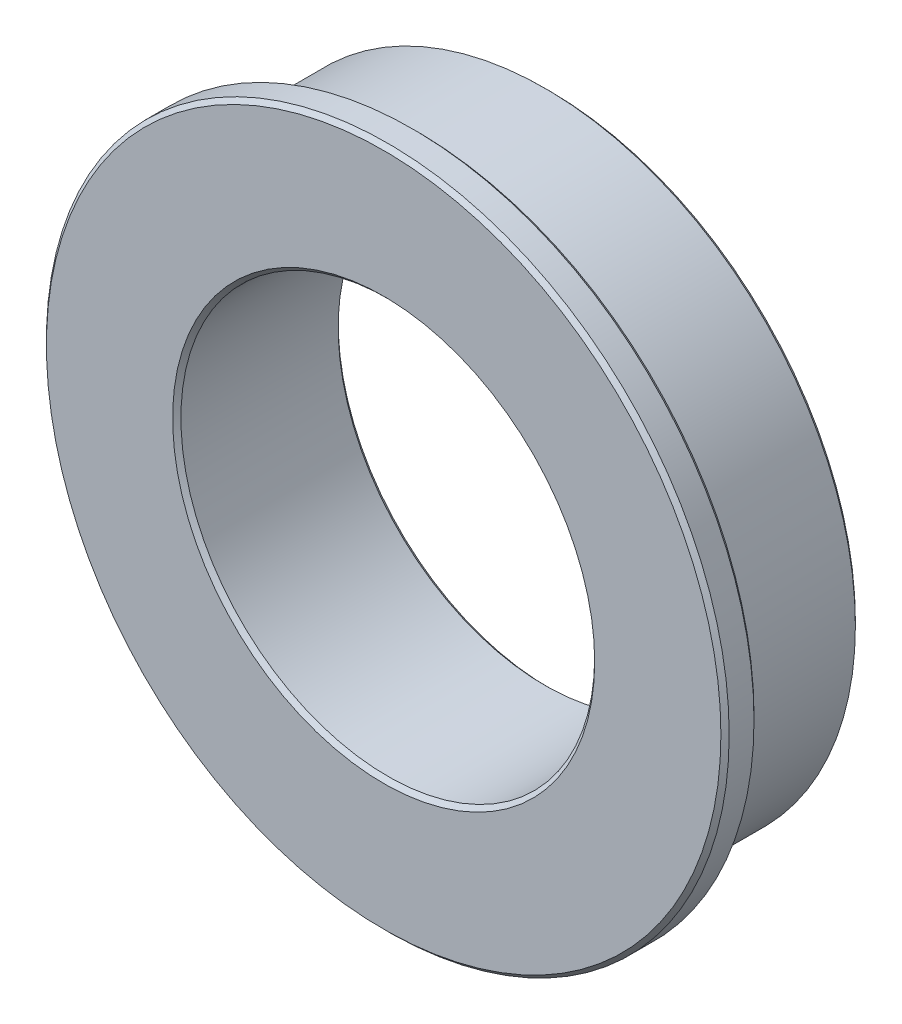
ISO-10303-21;
HEADER;
FILE_DESCRIPTION(('STEP AP214'),'2;1');
FILE_NAME('part.step','',(''),(''),'','','');
FILE_SCHEMA(('AUTOMOTIVE_DESIGN { 1 0 10303 214 1 1 1 1 }'));
ENDSEC;
DATA;
#1=APPLICATION_CONTEXT('core data for automotive mechanical design processes');
#2=APPLICATION_PROTOCOL_DEFINITION('international standard','automotive_design',2000,#1);
#3=PRODUCT_CONTEXT('',#1,'mechanical');
#4=PRODUCT('Part','Part','',(#3));
#5=PRODUCT_RELATED_PRODUCT_CATEGORY('part','',(#4));
#6=PRODUCT_DEFINITION_FORMATION('','',#4);
#7=PRODUCT_DEFINITION_CONTEXT('part definition',#1,'design');
#8=PRODUCT_DEFINITION('design','',#6,#7);
#9=PRODUCT_DEFINITION_SHAPE('','',#8);
#10=(LENGTH_UNIT() NAMED_UNIT(*) SI_UNIT(.MILLI.,.METRE.));
#11=(NAMED_UNIT(*) PLANE_ANGLE_UNIT() SI_UNIT($,.RADIAN.));
#12=(NAMED_UNIT(*) SI_UNIT($,.STERADIAN.) SOLID_ANGLE_UNIT());
#13=UNCERTAINTY_MEASURE_WITH_UNIT(LENGTH_MEASURE(1.E-05),#10,'distance_accuracy_value','');
#14=(GEOMETRIC_REPRESENTATION_CONTEXT(3) GLOBAL_UNCERTAINTY_ASSIGNED_CONTEXT((#13)) GLOBAL_UNIT_ASSIGNED_CONTEXT((#10,
#11,#12)) REPRESENTATION_CONTEXT('',''));
#15=CARTESIAN_POINT('',(0.,0.,0.));
#16=DIRECTION('',(0.,0.,1.));
#17=DIRECTION('',(1.,0.,0.));
#18=AXIS2_PLACEMENT_3D('',#15,#16,#17);
#19=CARTESIAN_POINT('',(0.,0.,4.));
#20=DIRECTION('',(0.,0.,-1.));
#21=DIRECTION('',(-1.,0.,0.));
#22=AXIS2_PLACEMENT_3D('',#19,#20,#21);
#23=CYLINDRICAL_SURFACE('',#22,7.5);
#24=CARTESIAN_POINT('',(0.,0.,0.100000000000002));
#25=DIRECTION('',(0.,0.,1.));
#26=DIRECTION('',(1.,0.,0.));
#27=AXIS2_PLACEMENT_3D('',#24,#25,#26);
#28=CIRCLE('',#27,7.5);
#29=CARTESIAN_POINT('',(7.5,0.,0.100000000000002));
#30=VERTEX_POINT('',#29);
#31=EDGE_CURVE('E57',#30,#30,#28,.T.);
#32=ORIENTED_EDGE('',*,*,#31,.T.);
#33=EDGE_LOOP('',(#32));
#34=FACE_BOUND('',#33,.T.);
#35=CARTESIAN_POINT('',(0.,0.,3.2));
#36=DIRECTION('',(0.,0.,1.));
#37=DIRECTION('',(1.,0.,0.));
#38=AXIS2_PLACEMENT_3D('',#35,#36,#37);
#39=CIRCLE('',#38,7.5);
#40=CARTESIAN_POINT('',(7.5,0.,3.2));
#41=VERTEX_POINT('',#40);
#42=EDGE_CURVE('E80',#41,#41,#39,.T.);
#43=ORIENTED_EDGE('',*,*,#42,.F.);
#44=EDGE_LOOP('',(#43));
#45=FACE_BOUND('',#44,.T.);
#46=ADVANCED_FACE('F41',(#34,#45),#23,.T.);
#47=CARTESIAN_POINT('',(0.,0.,4.));
#48=DIRECTION('',(0.,0.,1.));
#49=DIRECTION('',(1.,0.,0.));
#50=AXIS2_PLACEMENT_3D('',#47,#48,#49);
#51=PLANE('',#50);
#52=CARTESIAN_POINT('',(0.,0.,4.));
#53=DIRECTION('',(0.,0.,1.));
#54=DIRECTION('',(1.,0.,0.));
#55=AXIS2_PLACEMENT_3D('',#52,#53,#54);
#56=CIRCLE('',#55,5.1);
#57=CARTESIAN_POINT('',(5.1,0.,4.));
#58=VERTEX_POINT('',#57);
#59=EDGE_CURVE('E68',#58,#58,#56,.F.);
#60=ORIENTED_EDGE('',*,*,#59,.T.);
#61=EDGE_LOOP('',(#60));
#62=FACE_BOUND('',#61,.T.);
#63=CARTESIAN_POINT('',(0.,0.,4.));
#64=DIRECTION('',(0.,0.,1.));
#65=DIRECTION('',(1.,0.,0.));
#66=AXIS2_PLACEMENT_3D('',#63,#64,#65);
#67=CIRCLE('',#66,8.14999999999999);
#68=CARTESIAN_POINT('',(8.14999999999999,0.,4.));
#69=VERTEX_POINT('',#68);
#70=EDGE_CURVE('E71',#69,#69,#67,.T.);
#71=ORIENTED_EDGE('',*,*,#70,.T.);
#72=EDGE_LOOP('',(#71));
#73=FACE_BOUND('',#72,.T.);
#74=ADVANCED_FACE('F87',(#62,#73),#51,.T.);
#75=CARTESIAN_POINT('',(0.,0.,0.));
#76=DIRECTION('',(0.,0.,1.));
#77=DIRECTION('',(1.,0.,0.));
#78=AXIS2_PLACEMENT_3D('',#75,#76,#77);
#79=PLANE('',#78);
#80=CARTESIAN_POINT('',(0.,0.,0.));
#81=DIRECTION('',(0.,0.,1.));
#82=DIRECTION('',(1.,0.,0.));
#83=AXIS2_PLACEMENT_3D('',#80,#81,#82);
#84=CIRCLE('',#83,5.1);
#85=CARTESIAN_POINT('',(5.1,0.,0.));
#86=VERTEX_POINT('',#85);
#87=EDGE_CURVE('E62',#86,#86,#84,.T.);
#88=ORIENTED_EDGE('',*,*,#87,.T.);
#89=EDGE_LOOP('',(#88));
#90=FACE_BOUND('',#89,.T.);
#91=CARTESIAN_POINT('',(0.,0.,0.));
#92=DIRECTION('',(0.,0.,1.));
#93=DIRECTION('',(1.,0.,0.));
#94=AXIS2_PLACEMENT_3D('',#91,#92,#93);
#95=CIRCLE('',#94,7.4);
#96=CARTESIAN_POINT('',(7.4,0.,0.));
#97=VERTEX_POINT('',#96);
#98=EDGE_CURVE('E65',#97,#97,#95,.F.);
#99=ORIENTED_EDGE('',*,*,#98,.T.);
#100=EDGE_LOOP('',(#99));
#101=FACE_BOUND('',#100,.T.);
#102=ADVANCED_FACE('F93',(#90,#101),#79,.F.);
#103=CARTESIAN_POINT('',(0.,0.,4.));
#104=DIRECTION('',(0.,0.,-1.));
#105=DIRECTION('',(-1.,0.,0.));
#106=AXIS2_PLACEMENT_3D('',#103,#104,#105);
#107=CYLINDRICAL_SURFACE('',#106,5.);
#108=CARTESIAN_POINT('',(0.,0.,3.9));
#109=DIRECTION('',(0.,0.,1.));
#110=DIRECTION('',(1.,0.,0.));
#111=AXIS2_PLACEMENT_3D('',#108,#109,#110);
#112=CIRCLE('',#111,5.);
#113=CARTESIAN_POINT('',(5.,0.,3.9));
#114=VERTEX_POINT('',#113);
#115=EDGE_CURVE('E74',#114,#114,#112,.T.);
#116=ORIENTED_EDGE('',*,*,#115,.T.);
#117=EDGE_LOOP('',(#116));
#118=FACE_BOUND('',#117,.T.);
#119=CARTESIAN_POINT('',(0.,0.,0.100000000000001));
#120=DIRECTION('',(0.,0.,1.));
#121=DIRECTION('',(1.,0.,0.));
#122=AXIS2_PLACEMENT_3D('',#119,#120,#121);
#123=CIRCLE('',#122,5.);
#124=CARTESIAN_POINT('',(5.,0.,0.100000000000001));
#125=VERTEX_POINT('',#124);
#126=EDGE_CURVE('E77',#125,#125,#123,.F.);
#127=ORIENTED_EDGE('',*,*,#126,.T.);
#128=EDGE_LOOP('',(#127));
#129=FACE_BOUND('',#128,.T.);
#130=ADVANCED_FACE('F138',(#118,#129),#107,.F.);
#131=CARTESIAN_POINT('',(0.,0.,3.2));
#132=DIRECTION('',(0.,0.,1.));
#133=DIRECTION('',(1.,0.,0.));
#134=AXIS2_PLACEMENT_3D('',#131,#132,#133);
#135=CYLINDRICAL_SURFACE('',#134,8.25);
#136=CARTESIAN_POINT('',(0.,0.,3.89999999999999));
#137=DIRECTION('',(0.,0.,1.));
#138=DIRECTION('',(1.,0.,0.));
#139=AXIS2_PLACEMENT_3D('',#136,#137,#138);
#140=CIRCLE('',#139,8.25);
#141=CARTESIAN_POINT('',(8.25,0.,3.89999999999999));
#142=VERTEX_POINT('',#141);
#143=EDGE_CURVE('E49',#142,#142,#140,.F.);
#144=ORIENTED_EDGE('',*,*,#143,.T.);
#145=EDGE_LOOP('',(#144));
#146=FACE_BOUND('',#145,.T.);
#147=CARTESIAN_POINT('',(0.,0.,3.3));
#148=DIRECTION('',(0.,0.,1.));
#149=DIRECTION('',(1.,0.,0.));
#150=AXIS2_PLACEMENT_3D('',#147,#148,#149);
#151=CIRCLE('',#150,8.25);
#152=CARTESIAN_POINT('',(8.25,0.,3.3));
#153=VERTEX_POINT('',#152);
#154=EDGE_CURVE('E53',#153,#153,#151,.T.);
#155=ORIENTED_EDGE('',*,*,#154,.T.);
#156=EDGE_LOOP('',(#155));
#157=FACE_BOUND('',#156,.T.);
#158=ADVANCED_FACE('F136',(#146,#157),#135,.T.);
#159=CARTESIAN_POINT('',(0.,0.,3.2));
#160=DIRECTION('',(0.,0.,1.));
#161=DIRECTION('',(1.,0.,0.));
#162=AXIS2_PLACEMENT_3D('',#159,#160,#161);
#163=PLANE('',#162);
#164=CARTESIAN_POINT('',(0.,0.,3.2));
#165=DIRECTION('',(0.,0.,1.));
#166=DIRECTION('',(1.,0.,0.));
#167=AXIS2_PLACEMENT_3D('',#164,#165,#166);
#168=CIRCLE('',#167,8.15);
#169=CARTESIAN_POINT('',(8.15,0.,3.2));
#170=VERTEX_POINT('',#169);
#171=EDGE_CURVE('E10',#170,#170,#168,.F.);
#172=ORIENTED_EDGE('',*,*,#171,.T.);
#173=EDGE_LOOP('',(#172));
#174=FACE_BOUND('',#173,.T.);
#175=ORIENTED_EDGE('',*,*,#42,.T.);
#176=EDGE_LOOP('',(#175));
#177=FACE_BOUND('',#176,.T.);
#178=ADVANCED_FACE('F84',(#174,#177),#163,.F.);
#179=CARTESIAN_POINT('',(0.,0.,3.9));
#180=DIRECTION('',(0.,0.,1.));
#181=DIRECTION('',(1.,0.,0.));
#182=AXIS2_PLACEMENT_3D('',#179,#180,#181);
#183=CONICAL_SURFACE('',#182,5.,0.785398163397448);
#184=ORIENTED_EDGE('',*,*,#59,.F.);
#185=EDGE_LOOP('',(#184));
#186=FACE_BOUND('',#185,.T.);
#187=ORIENTED_EDGE('',*,*,#115,.F.);
#188=EDGE_LOOP('',(#187));
#189=FACE_BOUND('',#188,.T.);
#190=ADVANCED_FACE('F99',(#186,#189),#183,.F.);
#191=CARTESIAN_POINT('',(0.,0.,0.));
#192=DIRECTION('',(0.,0.,-1.));
#193=DIRECTION('',(-1.,0.,0.));
#194=AXIS2_PLACEMENT_3D('',#191,#192,#193);
#195=CONICAL_SURFACE('',#194,5.1,0.785398163397457);
#196=ORIENTED_EDGE('',*,*,#126,.F.);
#197=EDGE_LOOP('',(#196));
#198=FACE_BOUND('',#197,.T.);
#199=ORIENTED_EDGE('',*,*,#87,.F.);
#200=EDGE_LOOP('',(#199));
#201=FACE_BOUND('',#200,.T.);
#202=ADVANCED_FACE('F105',(#198,#201),#195,.F.);
#203=CARTESIAN_POINT('',(0.,0.,0.100000000000002));
#204=DIRECTION('',(0.,0.,1.));
#205=DIRECTION('',(1.,0.,0.));
#206=AXIS2_PLACEMENT_3D('',#203,#204,#205);
#207=CONICAL_SURFACE('',#206,7.5,0.78539816339744);
#208=ORIENTED_EDGE('',*,*,#98,.F.);
#209=EDGE_LOOP('',(#208));
#210=FACE_BOUND('',#209,.T.);
#211=ORIENTED_EDGE('',*,*,#31,.F.);
#212=EDGE_LOOP('',(#211));
#213=FACE_BOUND('',#212,.T.);
#214=ADVANCED_FACE('F112',(#210,#213),#207,.T.);
#215=CARTESIAN_POINT('',(0.,0.,4.));
#216=DIRECTION('',(0.,0.,-1.));
#217=DIRECTION('',(-1.,0.,0.));
#218=AXIS2_PLACEMENT_3D('',#215,#216,#217);
#219=CONICAL_SURFACE('',#218,8.14999999999999,0.785398163397448);
#220=ORIENTED_EDGE('',*,*,#143,.F.);
#221=EDGE_LOOP('',(#220));
#222=FACE_BOUND('',#221,.T.);
#223=ORIENTED_EDGE('',*,*,#70,.F.);
#224=EDGE_LOOP('',(#223));
#225=FACE_BOUND('',#224,.T.);
#226=ADVANCED_FACE('F118',(#222,#225),#219,.T.);
#227=CARTESIAN_POINT('',(0.,0.,3.3));
#228=DIRECTION('',(0.,0.,1.));
#229=DIRECTION('',(1.,0.,0.));
#230=AXIS2_PLACEMENT_3D('',#227,#228,#229);
#231=CONICAL_SURFACE('',#230,8.25,0.78539816339744);
#232=ORIENTED_EDGE('',*,*,#171,.F.);
#233=EDGE_LOOP('',(#232));
#234=FACE_BOUND('',#233,.T.);
#235=ORIENTED_EDGE('',*,*,#154,.F.);
#236=EDGE_LOOP('',(#235));
#237=FACE_BOUND('',#236,.T.);
#238=ADVANCED_FACE('F44',(#234,#237),#231,.T.);
#239=CLOSED_SHELL('',(#46,#74,#102,#130,#158,#178,#190,#202,#214,#226,#238));
#240=MANIFOLD_SOLID_BREP('B2',#239);
#241=ADVANCED_BREP_SHAPE_REPRESENTATION('',(#18,#240),#14);
#242=SHAPE_DEFINITION_REPRESENTATION(#9,#241);
ENDSEC;
END-ISO-10303-21;
